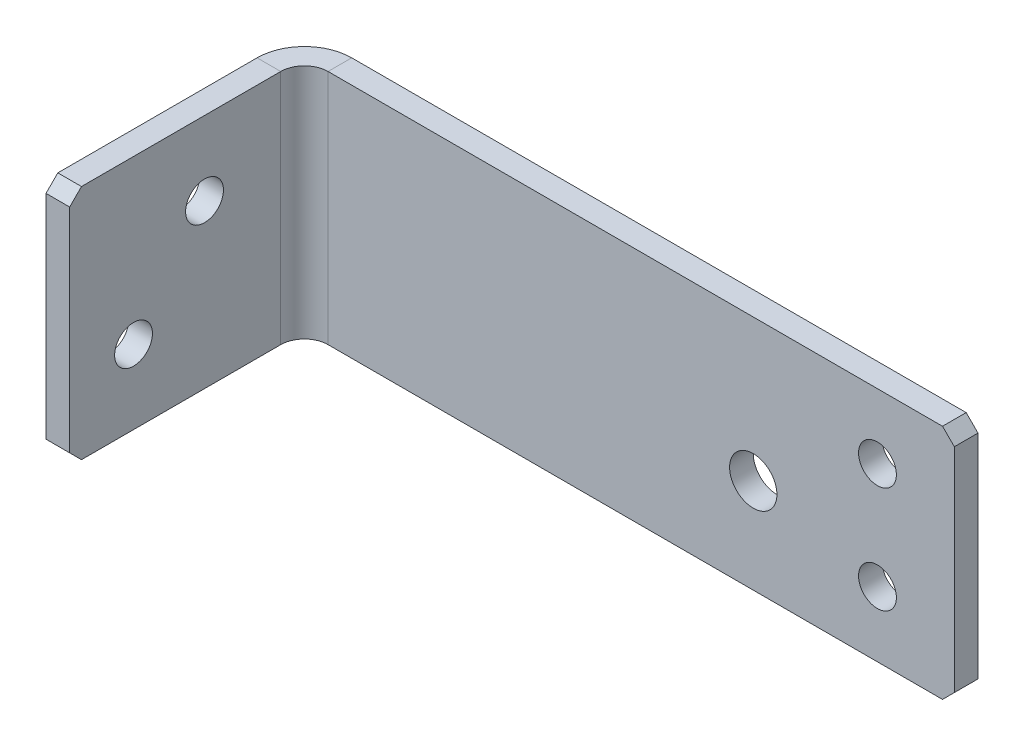
ISO-10303-21;
HEADER;
FILE_DESCRIPTION(('STEP AP214'),'2;1');
FILE_NAME('part.step','',(''),(''),'','','');
FILE_SCHEMA(('AUTOMOTIVE_DESIGN { 1 0 10303 214 1 1 1 1 }'));
ENDSEC;
DATA;
#1=APPLICATION_CONTEXT('core data for automotive mechanical design processes');
#2=APPLICATION_PROTOCOL_DEFINITION('international standard','automotive_design',2000,#1);
#3=PRODUCT_CONTEXT('',#1,'mechanical');
#4=PRODUCT('Part','Part','',(#3));
#5=PRODUCT_RELATED_PRODUCT_CATEGORY('part','',(#4));
#6=PRODUCT_DEFINITION_FORMATION('','',#4);
#7=PRODUCT_DEFINITION_CONTEXT('part definition',#1,'design');
#8=PRODUCT_DEFINITION('design','',#6,#7);
#9=PRODUCT_DEFINITION_SHAPE('','',#8);
#10=(LENGTH_UNIT() NAMED_UNIT(*) SI_UNIT(.MILLI.,.METRE.));
#11=(NAMED_UNIT(*) PLANE_ANGLE_UNIT() SI_UNIT($,.RADIAN.));
#12=(NAMED_UNIT(*) SI_UNIT($,.STERADIAN.) SOLID_ANGLE_UNIT());
#13=UNCERTAINTY_MEASURE_WITH_UNIT(LENGTH_MEASURE(1.E-05),#10,'distance_accuracy_value','');
#14=(GEOMETRIC_REPRESENTATION_CONTEXT(3) GLOBAL_UNCERTAINTY_ASSIGNED_CONTEXT((#13)) GLOBAL_UNIT_ASSIGNED_CONTEXT((#10,
#11,#12)) REPRESENTATION_CONTEXT('',''));
#15=CARTESIAN_POINT('',(0.,0.,0.));
#16=DIRECTION('',(0.,0.,1.));
#17=DIRECTION('',(1.,0.,0.));
#18=AXIS2_PLACEMENT_3D('',#15,#16,#17);
#19=CARTESIAN_POINT('',(18.5561944901924,0.,21.8438055098076));
#20=DIRECTION('',(1.,0.,0.));
#21=DIRECTION('',(0.,0.,-1.));
#22=AXIS2_PLACEMENT_3D('',#19,#20,#21);
#23=PLANE('',#22);
#24=CARTESIAN_POINT('',(18.5561944901924,6.25,16.4438055098076));
#25=DIRECTION('',(1.,0.,0.));
#26=DIRECTION('',(0.,0.,-1.));
#27=AXIS2_PLACEMENT_3D('',#24,#25,#26);
#28=CIRCLE('',#27,1.6);
#29=CARTESIAN_POINT('',(18.5561944901924,6.25,14.8438055098076));
#30=VERTEX_POINT('',#29);
#31=EDGE_CURVE('E220',#30,#30,#28,.T.);
#32=ORIENTED_EDGE('',*,*,#31,.T.);
#33=EDGE_LOOP('',(#32));
#34=FACE_BOUND('',#33,.T.);
#35=CARTESIAN_POINT('',(18.5561944901924,13.75,10.4438055098077));
#36=DIRECTION('',(1.,0.,0.));
#37=DIRECTION('',(0.,0.,-1.));
#38=AXIS2_PLACEMENT_3D('',#35,#36,#37);
#39=CIRCLE('',#38,1.6);
#40=CARTESIAN_POINT('',(18.5561944901924,13.75,8.84380550980767));
#41=VERTEX_POINT('',#40);
#42=EDGE_CURVE('E214',#41,#41,#39,.T.);
#43=ORIENTED_EDGE('',*,*,#42,.T.);
#44=EDGE_LOOP('',(#43));
#45=FACE_BOUND('',#44,.T.);
#46=DIRECTION('',(0.,0.,-1.));
#47=VECTOR('',#46,1.);
#48=CARTESIAN_POINT('',(18.5561944901924,0.,21.8438055098076));
#49=LINE('',#48,#47);
#50=CARTESIAN_POINT('',(18.5561944901924,0.,20.8438055098076));
#51=VERTEX_POINT('',#50);
#52=CARTESIAN_POINT('',(18.5561944901924,0.,4.));
#53=VERTEX_POINT('',#52);
#54=EDGE_CURVE('E229',#51,#53,#49,.T.);
#55=ORIENTED_EDGE('',*,*,#54,.F.);
#56=DIRECTION('',(0.,-0.707106781186548,-0.707106781186547));
#57=VECTOR('',#56,1.);
#58=CARTESIAN_POINT('',(18.5561944901924,0.,20.8438055098076));
#59=LINE('',#58,#57);
#60=CARTESIAN_POINT('',(18.5561944901925,1.00000000000001,21.8438055098076));
#61=VERTEX_POINT('',#60);
#62=EDGE_CURVE('E69',#51,#61,#59,.F.);
#63=ORIENTED_EDGE('',*,*,#62,.T.);
#64=DIRECTION('',(0.,-1.,0.));
#65=VECTOR('',#64,1.);
#66=CARTESIAN_POINT('',(18.5561944901924,20.,21.8438055098076));
#67=LINE('',#66,#65);
#68=CARTESIAN_POINT('',(18.5561944901924,19.,21.8438055098076));
#69=VERTEX_POINT('',#68);
#70=EDGE_CURVE('E223',#69,#61,#67,.T.);
#71=ORIENTED_EDGE('',*,*,#70,.F.);
#72=DIRECTION('',(0.,-0.707106781186547,0.707106781186547));
#73=VECTOR('',#72,1.);
#74=CARTESIAN_POINT('',(18.5561944901924,19.,21.8438055098076));
#75=LINE('',#74,#73);
#76=CARTESIAN_POINT('',(18.5561944901924,20.,20.8438055098076));
#77=VERTEX_POINT('',#76);
#78=EDGE_CURVE('E269',#69,#77,#75,.F.);
#79=ORIENTED_EDGE('',*,*,#78,.T.);
#80=DIRECTION('',(0.,0.,1.));
#81=VECTOR('',#80,1.);
#82=CARTESIAN_POINT('',(18.5561944901924,20.,21.8438055098076));
#83=LINE('',#82,#81);
#84=CARTESIAN_POINT('',(18.5561944901924,20.,4.));
#85=VERTEX_POINT('',#84);
#86=EDGE_CURVE('E227',#85,#77,#83,.T.);
#87=ORIENTED_EDGE('',*,*,#86,.F.);
#88=DIRECTION('',(0.,-1.,0.));
#89=VECTOR('',#88,1.);
#90=CARTESIAN_POINT('',(18.5561944901924,0.,4.));
#91=LINE('',#90,#89);
#92=EDGE_CURVE('E235',#85,#53,#91,.T.);
#93=ORIENTED_EDGE('',*,*,#92,.T.);
#94=EDGE_LOOP('',(#55,#63,#71,#79,#87,#93));
#95=FACE_BOUND('',#94,.T.);
#96=ADVANCED_FACE('F46',(#34,#45,#95),#23,.F.);
#97=CARTESIAN_POINT('',(20.5561944901924,20.,21.8438055098076));
#98=DIRECTION('',(0.,-1.,0.));
#99=DIRECTION('',(-1.,0.,0.));
#100=AXIS2_PLACEMENT_3D('',#97,#98,#99);
#101=PLANE('',#100);
#102=ORIENTED_EDGE('',*,*,#86,.T.);
#103=DIRECTION('',(1.,0.,0.));
#104=VECTOR('',#103,1.);
#105=CARTESIAN_POINT('',(20.5561944901924,20.,20.8438055098076));
#106=LINE('',#105,#104);
#107=CARTESIAN_POINT('',(20.5561944901924,20.,20.8438055098076));
#108=VERTEX_POINT('',#107);
#109=EDGE_CURVE('E271',#77,#108,#106,.T.);
#110=ORIENTED_EDGE('',*,*,#109,.T.);
#111=DIRECTION('',(0.,0.,1.));
#112=VECTOR('',#111,1.);
#113=CARTESIAN_POINT('',(20.5561944901924,20.,21.8438055098076));
#114=LINE('',#113,#112);
#115=CARTESIAN_POINT('',(20.5561944901924,20.,4.));
#116=VERTEX_POINT('',#115);
#117=EDGE_CURVE('E232',#116,#108,#114,.T.);
#118=ORIENTED_EDGE('',*,*,#117,.F.);
#119=DIRECTION('',(-1.,0.,0.));
#120=VECTOR('',#119,1.);
#121=CARTESIAN_POINT('',(20.5561944901924,20.,4.));
#122=LINE('',#121,#120);
#123=EDGE_CURVE('E238',#116,#85,#122,.T.);
#124=ORIENTED_EDGE('',*,*,#123,.T.);
#125=EDGE_LOOP('',(#102,#110,#118,#124));
#126=FACE_BOUND('',#125,.T.);
#127=ADVANCED_FACE('F321',(#126),#101,.F.);
#128=CARTESIAN_POINT('',(20.5561944901924,0.,21.8438055098076));
#129=DIRECTION('',(0.,1.,0.));
#130=DIRECTION('',(1.,0.,0.));
#131=AXIS2_PLACEMENT_3D('',#128,#129,#130);
#132=PLANE('',#131);
#133=DIRECTION('',(0.,0.,-1.));
#134=VECTOR('',#133,1.);
#135=CARTESIAN_POINT('',(20.5561944901924,0.,21.8438055098076));
#136=LINE('',#135,#134);
#137=CARTESIAN_POINT('',(20.5561944901924,0.,20.8438055098076));
#138=VERTEX_POINT('',#137);
#139=CARTESIAN_POINT('',(20.5561944901924,0.,4.));
#140=VERTEX_POINT('',#139);
#141=EDGE_CURVE('E226',#138,#140,#136,.T.);
#142=ORIENTED_EDGE('',*,*,#141,.F.);
#143=DIRECTION('',(-1.,0.,0.));
#144=VECTOR('',#143,1.);
#145=CARTESIAN_POINT('',(20.5561944901924,0.,20.8438055098076));
#146=LINE('',#145,#144);
#147=EDGE_CURVE('E275',#138,#51,#146,.T.);
#148=ORIENTED_EDGE('',*,*,#147,.T.);
#149=ORIENTED_EDGE('',*,*,#54,.T.);
#150=DIRECTION('',(1.,0.,0.));
#151=VECTOR('',#150,1.);
#152=CARTESIAN_POINT('',(20.5561944901924,0.,4.));
#153=LINE('',#152,#151);
#154=EDGE_CURVE('E231',#53,#140,#153,.T.);
#155=ORIENTED_EDGE('',*,*,#154,.T.);
#156=EDGE_LOOP('',(#142,#148,#149,#155));
#157=FACE_BOUND('',#156,.T.);
#158=ADVANCED_FACE('F281',(#157),#132,.F.);
#159=CARTESIAN_POINT('',(20.5561944901924,20.,21.8438055098076));
#160=DIRECTION('',(0.,0.,-1.));
#161=DIRECTION('',(0.,1.,0.));
#162=AXIS2_PLACEMENT_3D('',#159,#160,#161);
#163=PLANE('',#162);
#164=ORIENTED_EDGE('',*,*,#70,.T.);
#165=DIRECTION('',(1.,0.,0.));
#166=VECTOR('',#165,1.);
#167=CARTESIAN_POINT('',(20.5561944901925,1.00000000000001,21.8438055098076));
#168=LINE('',#167,#166);
#169=CARTESIAN_POINT('',(20.5561944901925,1.00000000000001,21.8438055098076));
#170=VERTEX_POINT('',#169);
#171=EDGE_CURVE('E55',#61,#170,#168,.T.);
#172=ORIENTED_EDGE('',*,*,#171,.T.);
#173=DIRECTION('',(0.,-1.,0.));
#174=VECTOR('',#173,1.);
#175=CARTESIAN_POINT('',(20.5561944901924,20.,21.8438055098076));
#176=LINE('',#175,#174);
#177=CARTESIAN_POINT('',(20.5561944901924,19.,21.8438055098076));
#178=VERTEX_POINT('',#177);
#179=EDGE_CURVE('E224',#178,#170,#176,.T.);
#180=ORIENTED_EDGE('',*,*,#179,.F.);
#181=DIRECTION('',(-1.,0.,0.));
#182=VECTOR('',#181,1.);
#183=CARTESIAN_POINT('',(20.5561944901924,19.,21.8438055098076));
#184=LINE('',#183,#182);
#185=EDGE_CURVE('E266',#178,#69,#184,.T.);
#186=ORIENTED_EDGE('',*,*,#185,.T.);
#187=EDGE_LOOP('',(#164,#172,#180,#186));
#188=FACE_BOUND('',#187,.T.);
#189=ADVANCED_FACE('F343',(#188),#163,.F.);
#190=CARTESIAN_POINT('',(20.5561944901924,0.,21.8438055098076));
#191=DIRECTION('',(1.,0.,0.));
#192=DIRECTION('',(0.,0.,-1.));
#193=AXIS2_PLACEMENT_3D('',#190,#191,#192);
#194=PLANE('',#193);
#195=ORIENTED_EDGE('',*,*,#179,.T.);
#196=DIRECTION('',(0.,0.707106781186548,0.707106781186547));
#197=VECTOR('',#196,1.);
#198=CARTESIAN_POINT('',(20.5561944901925,0.500000000000007,21.3438055098076));
#199=LINE('',#198,#197);
#200=EDGE_CURVE('E12',#170,#138,#199,.F.);
#201=ORIENTED_EDGE('',*,*,#200,.T.);
#202=ORIENTED_EDGE('',*,*,#141,.T.);
#203=DIRECTION('',(0.,-1.,0.));
#204=VECTOR('',#203,1.);
#205=CARTESIAN_POINT('',(20.5561944901924,0.,4.));
#206=LINE('',#205,#204);
#207=EDGE_CURVE('E173',#116,#140,#206,.T.);
#208=ORIENTED_EDGE('',*,*,#207,.F.);
#209=ORIENTED_EDGE('',*,*,#117,.T.);
#210=DIRECTION('',(0.,0.707106781186547,-0.707106781186547));
#211=VECTOR('',#210,1.);
#212=CARTESIAN_POINT('',(20.5561944901925,9.5,31.3438055098076));
#213=LINE('',#212,#211);
#214=EDGE_CURVE('E273',#108,#178,#213,.F.);
#215=ORIENTED_EDGE('',*,*,#214,.T.);
#216=EDGE_LOOP('',(#195,#201,#202,#208,#209,#215));
#217=FACE_BOUND('',#216,.T.);
#218=CARTESIAN_POINT('',(20.5561944901924,13.75,10.4438055098077));
#219=DIRECTION('',(1.,0.,0.));
#220=DIRECTION('',(0.,0.,-1.));
#221=AXIS2_PLACEMENT_3D('',#218,#219,#220);
#222=CIRCLE('',#221,1.59999999999999);
#223=CARTESIAN_POINT('',(20.5561944901924,13.75,8.84380550980768));
#224=VERTEX_POINT('',#223);
#225=EDGE_CURVE('E187',#224,#224,#222,.T.);
#226=ORIENTED_EDGE('',*,*,#225,.F.);
#227=EDGE_LOOP('',(#226));
#228=FACE_BOUND('',#227,.T.);
#229=CARTESIAN_POINT('',(20.5561944901924,6.25000000000001,16.4438055098076));
#230=DIRECTION('',(1.,0.,0.));
#231=DIRECTION('',(0.,0.,-1.));
#232=AXIS2_PLACEMENT_3D('',#229,#230,#231);
#233=CIRCLE('',#232,1.59999999999999);
#234=CARTESIAN_POINT('',(20.5561944901924,6.25000000000001,14.8438055098076));
#235=VERTEX_POINT('',#234);
#236=EDGE_CURVE('E217',#235,#235,#233,.T.);
#237=ORIENTED_EDGE('',*,*,#236,.F.);
#238=EDGE_LOOP('',(#237));
#239=FACE_BOUND('',#238,.T.);
#240=ADVANCED_FACE('F344',(#217,#228,#239),#194,.T.);
#241=CARTESIAN_POINT('',(20.5561944901924,6.25000000000001,16.4438055098076));
#242=DIRECTION('',(1.,0.,0.));
#243=DIRECTION('',(0.,0.,-1.));
#244=AXIS2_PLACEMENT_3D('',#241,#242,#243);
#245=CYLINDRICAL_SURFACE('',#244,1.59999999999999);
#246=ORIENTED_EDGE('',*,*,#31,.F.);
#247=EDGE_LOOP('',(#246));
#248=FACE_BOUND('',#247,.T.);
#249=ORIENTED_EDGE('',*,*,#236,.T.);
#250=EDGE_LOOP('',(#249));
#251=FACE_BOUND('',#250,.T.);
#252=ADVANCED_FACE('F347',(#248,#251),#245,.F.);
#253=CARTESIAN_POINT('',(20.5561944901924,13.75,10.4438055098077));
#254=DIRECTION('',(1.,0.,0.));
#255=DIRECTION('',(0.,0.,-1.));
#256=AXIS2_PLACEMENT_3D('',#253,#254,#255);
#257=CYLINDRICAL_SURFACE('',#256,1.59999999999999);
#258=ORIENTED_EDGE('',*,*,#42,.F.);
#259=EDGE_LOOP('',(#258));
#260=FACE_BOUND('',#259,.T.);
#261=ORIENTED_EDGE('',*,*,#225,.T.);
#262=EDGE_LOOP('',(#261));
#263=FACE_BOUND('',#262,.T.);
#264=ADVANCED_FACE('F353',(#260,#263),#257,.F.);
#265=CARTESIAN_POINT('',(75.5,20.,2.));
#266=DIRECTION('',(-1.,0.,0.));
#267=DIRECTION('',(0.,0.,1.));
#268=AXIS2_PLACEMENT_3D('',#265,#266,#267);
#269=PLANE('',#268);
#270=DIRECTION('',(0.,1.,0.));
#271=VECTOR('',#270,1.);
#272=CARTESIAN_POINT('',(75.5,20.,2.));
#273=LINE('',#272,#271);
#274=CARTESIAN_POINT('',(75.5000000000001,1.00000000000001,2.));
#275=VERTEX_POINT('',#274);
#276=CARTESIAN_POINT('',(75.5,19.,2.));
#277=VERTEX_POINT('',#276);
#278=EDGE_CURVE('E147',#275,#277,#273,.T.);
#279=ORIENTED_EDGE('',*,*,#278,.F.);
#280=DIRECTION('',(0.,0.,-1.));
#281=VECTOR('',#280,1.);
#282=CARTESIAN_POINT('',(75.5000000000001,1.00000000000001,2.));
#283=LINE('',#282,#281);
#284=CARTESIAN_POINT('',(75.5000000000001,1.00000000000001,0.));
#285=VERTEX_POINT('',#284);
#286=EDGE_CURVE('E258',#275,#285,#283,.T.);
#287=ORIENTED_EDGE('',*,*,#286,.T.);
#288=DIRECTION('',(0.,1.,0.));
#289=VECTOR('',#288,1.);
#290=CARTESIAN_POINT('',(75.5,20.,0.));
#291=LINE('',#290,#289);
#292=CARTESIAN_POINT('',(75.5,19.,0.));
#293=VERTEX_POINT('',#292);
#294=EDGE_CURVE('E168',#285,#293,#291,.T.);
#295=ORIENTED_EDGE('',*,*,#294,.T.);
#296=DIRECTION('',(0.,0.,1.));
#297=VECTOR('',#296,1.);
#298=CARTESIAN_POINT('',(75.5,19.,2.));
#299=LINE('',#298,#297);
#300=EDGE_CURVE('E253',#293,#277,#299,.T.);
#301=ORIENTED_EDGE('',*,*,#300,.T.);
#302=EDGE_LOOP('',(#279,#287,#295,#301));
#303=FACE_BOUND('',#302,.T.);
#304=ADVANCED_FACE('F306',(#303),#269,.F.);
#305=CARTESIAN_POINT('',(58.5,8.00000000000001,2.));
#306=DIRECTION('',(0.,0.,1.));
#307=DIRECTION('',(1.,0.,0.));
#308=AXIS2_PLACEMENT_3D('',#305,#306,#307);
#309=CYLINDRICAL_SURFACE('',#308,2.);
#310=CARTESIAN_POINT('',(58.5,8.00000000000001,0.));
#311=DIRECTION('',(0.,0.,1.));
#312=DIRECTION('',(1.,0.,0.));
#313=AXIS2_PLACEMENT_3D('',#310,#311,#312);
#314=CIRCLE('',#313,1.99999999999999);
#315=CARTESIAN_POINT('',(60.5,8.00000000000001,0.));
#316=VERTEX_POINT('',#315);
#317=EDGE_CURVE('E194',#316,#316,#314,.T.);
#318=CARTESIAN_POINT('',(58.5,8.00000000000001,2.));
#319=DIRECTION('',(0.,0.,1.));
#320=DIRECTION('',(1.,0.,0.));
#321=AXIS2_PLACEMENT_3D('',#318,#319,#320);
#322=CIRCLE('',#321,2.);
#323=CARTESIAN_POINT('',(60.5,8.00000000000001,2.));
#324=VERTEX_POINT('',#323);
#325=EDGE_CURVE('E207',#324,#324,#322,.T.);
#326=CARTESIAN_POINT('',(60.5,8.00000000000001,0.));
#327=CARTESIAN_POINT('',(60.5,8.00000000000001,0.0208333333333333));
#328=CARTESIAN_POINT('',(60.5,8.00000000000001,0.0416666666666667));
#329=CARTESIAN_POINT('',(60.5,8.00000000000001,0.0833333333333334));
#330=CARTESIAN_POINT('',(60.5,8.00000000000001,0.104166666666667));
#331=CARTESIAN_POINT('',(60.5,8.00000000000001,0.145833333333333));
#332=CARTESIAN_POINT('',(60.5,8.00000000000001,0.166666666666667));
#333=CARTESIAN_POINT('',(60.5,8.00000000000001,0.208333333333334));
#334=CARTESIAN_POINT('',(60.5,8.00000000000001,0.229166666666667));
#335=CARTESIAN_POINT('',(60.5,8.00000000000001,0.270833333333333));
#336=CARTESIAN_POINT('',(60.5,8.00000000000001,0.291666666666667));
#337=CARTESIAN_POINT('',(60.5,8.00000000000001,0.333333333333333));
#338=CARTESIAN_POINT('',(60.5,8.00000000000001,0.354166666666667));
#339=CARTESIAN_POINT('',(60.5,8.00000000000001,0.395833333333334));
#340=CARTESIAN_POINT('',(60.5,8.00000000000001,0.416666666666667));
#341=CARTESIAN_POINT('',(60.5,8.00000000000001,0.458333333333334));
#342=CARTESIAN_POINT('',(60.5,8.00000000000001,0.479166666666667));
#343=CARTESIAN_POINT('',(60.5,8.00000000000001,0.520833333333334));
#344=CARTESIAN_POINT('',(60.5,8.00000000000001,0.541666666666667));
#345=CARTESIAN_POINT('',(60.5,8.00000000000001,0.583333333333334));
#346=CARTESIAN_POINT('',(60.5,8.00000000000001,0.604166666666667));
#347=CARTESIAN_POINT('',(60.5,8.00000000000001,0.645833333333334));
#348=CARTESIAN_POINT('',(60.5,8.00000000000001,0.666666666666667));
#349=CARTESIAN_POINT('',(60.5,8.00000000000001,0.708333333333334));
#350=CARTESIAN_POINT('',(60.5,8.00000000000001,0.729166666666668));
#351=CARTESIAN_POINT('',(60.5,8.00000000000001,0.770833333333334));
#352=CARTESIAN_POINT('',(60.5,8.00000000000001,0.791666666666667));
#353=CARTESIAN_POINT('',(60.5,8.00000000000001,0.833333333333334));
#354=CARTESIAN_POINT('',(60.5,8.00000000000001,0.854166666666667));
#355=CARTESIAN_POINT('',(60.5,8.00000000000001,0.895833333333334));
#356=CARTESIAN_POINT('',(60.5,8.00000000000001,0.916666666666668));
#357=CARTESIAN_POINT('',(60.5,8.00000000000001,0.958333333333334));
#358=CARTESIAN_POINT('',(60.5,8.00000000000001,0.979166666666668));
#359=CARTESIAN_POINT('',(60.5,8.00000000000001,1.02083333333333));
#360=CARTESIAN_POINT('',(60.5,8.00000000000001,1.04166666666667));
#361=CARTESIAN_POINT('',(60.5,8.00000000000001,1.08333333333333));
#362=CARTESIAN_POINT('',(60.5,8.00000000000001,1.10416666666667));
#363=CARTESIAN_POINT('',(60.5,8.00000000000001,1.14583333333333));
#364=CARTESIAN_POINT('',(60.5,8.00000000000001,1.16666666666667));
#365=CARTESIAN_POINT('',(60.5,8.00000000000001,1.20833333333333));
#366=CARTESIAN_POINT('',(60.5,8.00000000000001,1.22916666666667));
#367=CARTESIAN_POINT('',(60.5,8.00000000000001,1.27083333333333));
#368=CARTESIAN_POINT('',(60.5,8.00000000000001,1.29166666666667));
#369=CARTESIAN_POINT('',(60.5,8.00000000000001,1.33333333333333));
#370=CARTESIAN_POINT('',(60.5,8.00000000000001,1.35416666666667));
#371=CARTESIAN_POINT('',(60.5,8.00000000000001,1.39583333333333));
#372=CARTESIAN_POINT('',(60.5,8.00000000000001,1.41666666666667));
#373=CARTESIAN_POINT('',(60.5,8.00000000000001,1.45833333333333));
#374=CARTESIAN_POINT('',(60.5,8.00000000000001,1.47916666666667));
#375=CARTESIAN_POINT('',(60.5,8.00000000000001,1.52083333333333));
#376=CARTESIAN_POINT('',(60.5,8.00000000000001,1.54166666666667));
#377=CARTESIAN_POINT('',(60.5,8.00000000000001,1.58333333333333));
#378=CARTESIAN_POINT('',(60.5,8.00000000000001,1.60416666666667));
#379=CARTESIAN_POINT('',(60.5,8.00000000000001,1.64583333333333));
#380=CARTESIAN_POINT('',(60.5,8.00000000000001,1.66666666666667));
#381=CARTESIAN_POINT('',(60.5,8.00000000000001,1.70833333333333));
#382=CARTESIAN_POINT('',(60.5,8.00000000000001,1.72916666666667));
#383=CARTESIAN_POINT('',(60.5,8.00000000000001,1.77083333333334));
#384=CARTESIAN_POINT('',(60.5,8.00000000000001,1.79166666666667));
#385=CARTESIAN_POINT('',(60.5,8.00000000000001,1.83333333333334));
#386=CARTESIAN_POINT('',(60.5,8.00000000000001,1.85416666666667));
#387=CARTESIAN_POINT('',(60.5,8.00000000000001,1.89583333333334));
#388=CARTESIAN_POINT('',(60.5,8.00000000000001,1.91666666666667));
#389=CARTESIAN_POINT('',(60.5,8.00000000000001,1.95833333333334));
#390=CARTESIAN_POINT('',(60.5,8.00000000000001,1.97916666666667));
#391=CARTESIAN_POINT('',(60.5,8.00000000000001,2.));
#392=B_SPLINE_CURVE_WITH_KNOTS('',3,(#326,#327,#328,#329,#330,#331,#332,#333,#334,#335,#336,
#337,#338,#339,#340,#341,#342,#343,#344,#345,#346,#347,#348,#349,#350,#351,#352,#353,#354,#355,
#356,#357,#358,#359,#360,#361,#362,#363,#364,#365,#366,#367,#368,#369,#370,#371,#372,#373,#374,
#375,#376,#377,#378,#379,#380,#381,#382,#383,#384,#385,#386,#387,#388,#389,#390,#391),
.UNSPECIFIED.,.F.,.F.,(4,2,2,2,2,2,2,2,2,2,2,2,2,2,2,2,2,2,2,2,2,2,2,2,2,2,2,2,2,2,2,2,4),(0.,
0.0625000000000001,0.125,0.1875,0.25,0.3125,0.375,0.4375,0.5,0.5625,0.625000000000001,
0.687500000000001,0.750000000000001,0.812500000000001,0.875000000000001,0.937500000000001,1.,
1.0625,1.125,1.1875,1.25,1.3125,1.375,1.4375,1.5,1.5625,1.625,1.6875,1.75,1.8125,1.875,1.9375,
2.),.UNSPECIFIED.);
#393=EDGE_CURVE('BSEAM374',#316,#324,#392,.T.);
#394=ORIENTED_EDGE('',*,*,#317,.F.);
#395=ORIENTED_EDGE('',*,*,#325,.T.);
#396=ORIENTED_EDGE('',*,*,#393,.T.);
#397=ORIENTED_EDGE('',*,*,#393,.F.);
#398=EDGE_LOOP('',(#394,#396,#395,#397));
#399=FACE_BOUND('',#398,.T.);
#400=ADVANCED_FACE('F374',(#399),#309,.F.);
#401=CARTESIAN_POINT('',(69.,14.5,2.));
#402=DIRECTION('',(0.,0.,1.));
#403=DIRECTION('',(1.,0.,0.));
#404=AXIS2_PLACEMENT_3D('',#401,#402,#403);
#405=CYLINDRICAL_SURFACE('',#404,1.59999999999999);
#406=CARTESIAN_POINT('',(69.,14.5,0.));
#407=DIRECTION('',(0.,0.,1.));
#408=DIRECTION('',(1.,0.,0.));
#409=AXIS2_PLACEMENT_3D('',#406,#407,#408);
#410=CIRCLE('',#409,1.59999999999999);
#411=CARTESIAN_POINT('',(70.6,14.5,0.));
#412=VERTEX_POINT('',#411);
#413=EDGE_CURVE('E191',#412,#412,#410,.T.);
#414=CARTESIAN_POINT('',(69.,14.5,2.));
#415=DIRECTION('',(0.,0.,1.));
#416=DIRECTION('',(1.,0.,0.));
#417=AXIS2_PLACEMENT_3D('',#414,#415,#416);
#418=CIRCLE('',#417,1.59999999999999);
#419=CARTESIAN_POINT('',(70.6,14.5,2.));
#420=VERTEX_POINT('',#419);
#421=EDGE_CURVE('E204',#420,#420,#418,.T.);
#422=CARTESIAN_POINT('',(70.6,14.5,0.));
#423=CARTESIAN_POINT('',(70.6,14.5,0.0208333333333333));
#424=CARTESIAN_POINT('',(70.6,14.5,0.0416666666666667));
#425=CARTESIAN_POINT('',(70.6,14.5,0.0833333333333334));
#426=CARTESIAN_POINT('',(70.6,14.5,0.104166666666667));
#427=CARTESIAN_POINT('',(70.6,14.5,0.145833333333333));
#428=CARTESIAN_POINT('',(70.6,14.5,0.166666666666667));
#429=CARTESIAN_POINT('',(70.6,14.5,0.208333333333334));
#430=CARTESIAN_POINT('',(70.6,14.5,0.229166666666667));
#431=CARTESIAN_POINT('',(70.6,14.5,0.270833333333334));
#432=CARTESIAN_POINT('',(70.6,14.5,0.291666666666667));
#433=CARTESIAN_POINT('',(70.6,14.5,0.333333333333334));
#434=CARTESIAN_POINT('',(70.6,14.5,0.354166666666667));
#435=CARTESIAN_POINT('',(70.6,14.5,0.395833333333334));
#436=CARTESIAN_POINT('',(70.6,14.5,0.416666666666667));
#437=CARTESIAN_POINT('',(70.6,14.5,0.458333333333334));
#438=CARTESIAN_POINT('',(70.6,14.5,0.479166666666667));
#439=CARTESIAN_POINT('',(70.6,14.5,0.520833333333334));
#440=CARTESIAN_POINT('',(70.6,14.5,0.541666666666667));
#441=CARTESIAN_POINT('',(70.6,14.5,0.583333333333334));
#442=CARTESIAN_POINT('',(70.6,14.5,0.604166666666667));
#443=CARTESIAN_POINT('',(70.6,14.5,0.645833333333334));
#444=CARTESIAN_POINT('',(70.6,14.5,0.666666666666668));
#445=CARTESIAN_POINT('',(70.6,14.5,0.708333333333334));
#446=CARTESIAN_POINT('',(70.6,14.5,0.729166666666668));
#447=CARTESIAN_POINT('',(70.6,14.5,0.770833333333334));
#448=CARTESIAN_POINT('',(70.6,14.5,0.791666666666667));
#449=CARTESIAN_POINT('',(70.6,14.5,0.833333333333334));
#450=CARTESIAN_POINT('',(70.6,14.5,0.854166666666667));
#451=CARTESIAN_POINT('',(70.6,14.5,0.895833333333334));
#452=CARTESIAN_POINT('',(70.6,14.5,0.916666666666668));
#453=CARTESIAN_POINT('',(70.6,14.5,0.958333333333334));
#454=CARTESIAN_POINT('',(70.6,14.5,0.979166666666668));
#455=CARTESIAN_POINT('',(70.6,14.5,1.02083333333333));
#456=CARTESIAN_POINT('',(70.6,14.5,1.04166666666667));
#457=CARTESIAN_POINT('',(70.6,14.5,1.08333333333333));
#458=CARTESIAN_POINT('',(70.6,14.5,1.10416666666667));
#459=CARTESIAN_POINT('',(70.6,14.5,1.14583333333333));
#460=CARTESIAN_POINT('',(70.6,14.5,1.16666666666667));
#461=CARTESIAN_POINT('',(70.6,14.5,1.20833333333333));
#462=CARTESIAN_POINT('',(70.6,14.5,1.22916666666667));
#463=CARTESIAN_POINT('',(70.6,14.5,1.27083333333334));
#464=CARTESIAN_POINT('',(70.6,14.5,1.29166666666667));
#465=CARTESIAN_POINT('',(70.6,14.5,1.33333333333334));
#466=CARTESIAN_POINT('',(70.6,14.5,1.35416666666667));
#467=CARTESIAN_POINT('',(70.6,14.5,1.39583333333333));
#468=CARTESIAN_POINT('',(70.6,14.5,1.41666666666667));
#469=CARTESIAN_POINT('',(70.6,14.5,1.45833333333333));
#470=CARTESIAN_POINT('',(70.6,14.5,1.47916666666667));
#471=CARTESIAN_POINT('',(70.6,14.5,1.52083333333334));
#472=CARTESIAN_POINT('',(70.6,14.5,1.54166666666667));
#473=CARTESIAN_POINT('',(70.6,14.5,1.58333333333334));
#474=CARTESIAN_POINT('',(70.6,14.5,1.60416666666667));
#475=CARTESIAN_POINT('',(70.6,14.5,1.64583333333334));
#476=CARTESIAN_POINT('',(70.6,14.5,1.66666666666667));
#477=CARTESIAN_POINT('',(70.6,14.5,1.70833333333334));
#478=CARTESIAN_POINT('',(70.6,14.5,1.72916666666667));
#479=CARTESIAN_POINT('',(70.6,14.5,1.77083333333334));
#480=CARTESIAN_POINT('',(70.6,14.5,1.79166666666667));
#481=CARTESIAN_POINT('',(70.6,14.5,1.83333333333334));
#482=CARTESIAN_POINT('',(70.6,14.5,1.85416666666667));
#483=CARTESIAN_POINT('',(70.6,14.5,1.89583333333334));
#484=CARTESIAN_POINT('',(70.6,14.5,1.91666666666667));
#485=CARTESIAN_POINT('',(70.6,14.5,1.95833333333334));
#486=CARTESIAN_POINT('',(70.6,14.5,1.97916666666667));
#487=CARTESIAN_POINT('',(70.6,14.5,2.));
#488=B_SPLINE_CURVE_WITH_KNOTS('',3,(#422,#423,#424,#425,#426,#427,#428,#429,#430,#431,#432,
#433,#434,#435,#436,#437,#438,#439,#440,#441,#442,#443,#444,#445,#446,#447,#448,#449,#450,#451,
#452,#453,#454,#455,#456,#457,#458,#459,#460,#461,#462,#463,#464,#465,#466,#467,#468,#469,#470,
#471,#472,#473,#474,#475,#476,#477,#478,#479,#480,#481,#482,#483,#484,#485,#486,#487),
.UNSPECIFIED.,.F.,.F.,(4,2,2,2,2,2,2,2,2,2,2,2,2,2,2,2,2,2,2,2,2,2,2,2,2,2,2,2,2,2,2,2,4),(0.,
0.0625000000000001,0.125,0.1875,0.25,0.3125,0.375,0.4375,0.500000000000001,0.562500000000001,
0.625000000000001,0.687500000000001,0.750000000000001,0.812500000000001,0.875000000000001,
0.937500000000001,1.,1.0625,1.125,1.1875,1.25,1.3125,1.375,1.4375,1.5,1.5625,1.625,1.6875,1.75,
1.8125,1.875,1.9375,2.),.UNSPECIFIED.);
#489=EDGE_CURVE('BSEAM370',#412,#420,#488,.T.);
#490=ORIENTED_EDGE('',*,*,#413,.F.);
#491=ORIENTED_EDGE('',*,*,#421,.T.);
#492=ORIENTED_EDGE('',*,*,#489,.T.);
#493=ORIENTED_EDGE('',*,*,#489,.F.);
#494=EDGE_LOOP('',(#490,#492,#491,#493));
#495=FACE_BOUND('',#494,.T.);
#496=ADVANCED_FACE('F370',(#495),#405,.F.);
#497=CARTESIAN_POINT('',(69.,5.5,2.));
#498=DIRECTION('',(0.,0.,1.));
#499=DIRECTION('',(1.,0.,0.));
#500=AXIS2_PLACEMENT_3D('',#497,#498,#499);
#501=CYLINDRICAL_SURFACE('',#500,1.59999999999999);
#502=CARTESIAN_POINT('',(69.,5.5,0.));
#503=DIRECTION('',(0.,0.,1.));
#504=DIRECTION('',(1.,0.,0.));
#505=AXIS2_PLACEMENT_3D('',#502,#503,#504);
#506=CIRCLE('',#505,1.59999999999999);
#507=CARTESIAN_POINT('',(70.6,5.5,0.));
#508=VERTEX_POINT('',#507);
#509=EDGE_CURVE('E188',#508,#508,#506,.T.);
#510=CARTESIAN_POINT('',(69.,5.5,2.));
#511=DIRECTION('',(0.,0.,1.));
#512=DIRECTION('',(1.,0.,0.));
#513=AXIS2_PLACEMENT_3D('',#510,#511,#512);
#514=CIRCLE('',#513,1.59999999999999);
#515=CARTESIAN_POINT('',(70.6,5.5,2.));
#516=VERTEX_POINT('',#515);
#517=EDGE_CURVE('E201',#516,#516,#514,.T.);
#518=CARTESIAN_POINT('',(70.6,5.5,0.));
#519=CARTESIAN_POINT('',(70.6,5.5,0.0208333333333333));
#520=CARTESIAN_POINT('',(70.6,5.5,0.0416666666666667));
#521=CARTESIAN_POINT('',(70.6,5.5,0.0833333333333334));
#522=CARTESIAN_POINT('',(70.6,5.5,0.104166666666667));
#523=CARTESIAN_POINT('',(70.6,5.5,0.145833333333333));
#524=CARTESIAN_POINT('',(70.6,5.5,0.166666666666667));
#525=CARTESIAN_POINT('',(70.6,5.5,0.208333333333334));
#526=CARTESIAN_POINT('',(70.6,5.5,0.229166666666667));
#527=CARTESIAN_POINT('',(70.6,5.5,0.270833333333334));
#528=CARTESIAN_POINT('',(70.6,5.5,0.291666666666667));
#529=CARTESIAN_POINT('',(70.6,5.5,0.333333333333334));
#530=CARTESIAN_POINT('',(70.6,5.5,0.354166666666667));
#531=CARTESIAN_POINT('',(70.6,5.5,0.395833333333334));
#532=CARTESIAN_POINT('',(70.6,5.5,0.416666666666667));
#533=CARTESIAN_POINT('',(70.6,5.5,0.458333333333334));
#534=CARTESIAN_POINT('',(70.6,5.5,0.479166666666667));
#535=CARTESIAN_POINT('',(70.6,5.5,0.520833333333334));
#536=CARTESIAN_POINT('',(70.6,5.5,0.541666666666667));
#537=CARTESIAN_POINT('',(70.6,5.5,0.583333333333334));
#538=CARTESIAN_POINT('',(70.6,5.5,0.604166666666667));
#539=CARTESIAN_POINT('',(70.6,5.5,0.645833333333334));
#540=CARTESIAN_POINT('',(70.6,5.5,0.666666666666668));
#541=CARTESIAN_POINT('',(70.6,5.5,0.708333333333334));
#542=CARTESIAN_POINT('',(70.6,5.5,0.729166666666668));
#543=CARTESIAN_POINT('',(70.6,5.5,0.770833333333334));
#544=CARTESIAN_POINT('',(70.6,5.5,0.791666666666667));
#545=CARTESIAN_POINT('',(70.6,5.5,0.833333333333334));
#546=CARTESIAN_POINT('',(70.6,5.5,0.854166666666667));
#547=CARTESIAN_POINT('',(70.6,5.5,0.895833333333334));
#548=CARTESIAN_POINT('',(70.6,5.5,0.916666666666668));
#549=CARTESIAN_POINT('',(70.6,5.5,0.958333333333334));
#550=CARTESIAN_POINT('',(70.6,5.5,0.979166666666668));
#551=CARTESIAN_POINT('',(70.6,5.5,1.02083333333333));
#552=CARTESIAN_POINT('',(70.6,5.5,1.04166666666667));
#553=CARTESIAN_POINT('',(70.6,5.5,1.08333333333333));
#554=CARTESIAN_POINT('',(70.6,5.5,1.10416666666667));
#555=CARTESIAN_POINT('',(70.6,5.5,1.14583333333333));
#556=CARTESIAN_POINT('',(70.6,5.5,1.16666666666667));
#557=CARTESIAN_POINT('',(70.6,5.5,1.20833333333333));
#558=CARTESIAN_POINT('',(70.6,5.5,1.22916666666667));
#559=CARTESIAN_POINT('',(70.6,5.5,1.27083333333334));
#560=CARTESIAN_POINT('',(70.6,5.5,1.29166666666667));
#561=CARTESIAN_POINT('',(70.6,5.5,1.33333333333334));
#562=CARTESIAN_POINT('',(70.6,5.5,1.35416666666667));
#563=CARTESIAN_POINT('',(70.6,5.5,1.39583333333333));
#564=CARTESIAN_POINT('',(70.6,5.5,1.41666666666667));
#565=CARTESIAN_POINT('',(70.6,5.5,1.45833333333333));
#566=CARTESIAN_POINT('',(70.6,5.5,1.47916666666667));
#567=CARTESIAN_POINT('',(70.6,5.5,1.52083333333334));
#568=CARTESIAN_POINT('',(70.6,5.5,1.54166666666667));
#569=CARTESIAN_POINT('',(70.6,5.5,1.58333333333334));
#570=CARTESIAN_POINT('',(70.6,5.5,1.60416666666667));
#571=CARTESIAN_POINT('',(70.6,5.5,1.64583333333334));
#572=CARTESIAN_POINT('',(70.6,5.5,1.66666666666667));
#573=CARTESIAN_POINT('',(70.6,5.5,1.70833333333334));
#574=CARTESIAN_POINT('',(70.6,5.5,1.72916666666667));
#575=CARTESIAN_POINT('',(70.6,5.5,1.77083333333334));
#576=CARTESIAN_POINT('',(70.6,5.5,1.79166666666667));
#577=CARTESIAN_POINT('',(70.6,5.5,1.83333333333334));
#578=CARTESIAN_POINT('',(70.6,5.5,1.85416666666667));
#579=CARTESIAN_POINT('',(70.6,5.5,1.89583333333334));
#580=CARTESIAN_POINT('',(70.6,5.5,1.91666666666667));
#581=CARTESIAN_POINT('',(70.6,5.5,1.95833333333334));
#582=CARTESIAN_POINT('',(70.6,5.5,1.97916666666667));
#583=CARTESIAN_POINT('',(70.6,5.5,2.));
#584=B_SPLINE_CURVE_WITH_KNOTS('',3,(#518,#519,#520,#521,#522,#523,#524,#525,#526,#527,#528,
#529,#530,#531,#532,#533,#534,#535,#536,#537,#538,#539,#540,#541,#542,#543,#544,#545,#546,#547,
#548,#549,#550,#551,#552,#553,#554,#555,#556,#557,#558,#559,#560,#561,#562,#563,#564,#565,#566,
#567,#568,#569,#570,#571,#572,#573,#574,#575,#576,#577,#578,#579,#580,#581,#582,#583),
.UNSPECIFIED.,.F.,.F.,(4,2,2,2,2,2,2,2,2,2,2,2,2,2,2,2,2,2,2,2,2,2,2,2,2,2,2,2,2,2,2,2,4),(0.,
0.0625000000000001,0.125,0.1875,0.25,0.3125,0.375,0.4375,0.500000000000001,0.562500000000001,
0.625000000000001,0.687500000000001,0.750000000000001,0.812500000000001,0.875000000000001,
0.937500000000001,1.,1.0625,1.125,1.1875,1.25,1.3125,1.375,1.4375,1.5,1.5625,1.625,1.6875,1.75,
1.8125,1.875,1.9375,2.),.UNSPECIFIED.);
#585=EDGE_CURVE('BSEAM366',#508,#516,#584,.T.);
#586=ORIENTED_EDGE('',*,*,#509,.F.);
#587=ORIENTED_EDGE('',*,*,#517,.T.);
#588=ORIENTED_EDGE('',*,*,#585,.T.);
#589=ORIENTED_EDGE('',*,*,#585,.F.);
#590=EDGE_LOOP('',(#586,#588,#587,#589));
#591=FACE_BOUND('',#590,.T.);
#592=ADVANCED_FACE('F366',(#591),#501,.F.);
#593=CARTESIAN_POINT('',(0.,0.,2.));
#594=DIRECTION('',(0.,0.,1.));
#595=DIRECTION('',(1.,0.,0.));
#596=AXIS2_PLACEMENT_3D('',#593,#594,#595);
#597=PLANE('',#596);
#598=ORIENTED_EDGE('',*,*,#517,.F.);
#599=EDGE_LOOP('',(#598));
#600=FACE_BOUND('',#599,.T.);
#601=ORIENTED_EDGE('',*,*,#421,.F.);
#602=EDGE_LOOP('',(#601));
#603=FACE_BOUND('',#602,.T.);
#604=ORIENTED_EDGE('',*,*,#325,.F.);
#605=EDGE_LOOP('',(#604));
#606=FACE_BOUND('',#605,.T.);
#607=DIRECTION('',(1.,0.,0.));
#608=VECTOR('',#607,1.);
#609=CARTESIAN_POINT('',(0.,0.,2.));
#610=LINE('',#609,#608);
#611=CARTESIAN_POINT('',(22.5561944901924,0.,2.));
#612=VERTEX_POINT('',#611);
#613=CARTESIAN_POINT('',(74.5,0.,2.));
#614=VERTEX_POINT('',#613);
#615=EDGE_CURVE('E136',#612,#614,#610,.T.);
#616=ORIENTED_EDGE('',*,*,#615,.T.);
#617=DIRECTION('',(-0.707106781186545,-0.70710678118655,0.));
#618=VECTOR('',#617,1.);
#619=CARTESIAN_POINT('',(37.2500000000003,-37.25,2.));
#620=LINE('',#619,#618);
#621=EDGE_CURVE('E264',#614,#275,#620,.F.);
#622=ORIENTED_EDGE('',*,*,#621,.T.);
#623=ORIENTED_EDGE('',*,*,#278,.T.);
#624=DIRECTION('',(0.707106781186545,-0.70710678118655,0.));
#625=VECTOR('',#624,1.);
#626=CARTESIAN_POINT('',(47.2500000000003,47.2499999999999,2.));
#627=LINE('',#626,#625);
#628=CARTESIAN_POINT('',(74.5,20.,2.));
#629=VERTEX_POINT('',#628);
#630=EDGE_CURVE('E256',#277,#629,#627,.F.);
#631=ORIENTED_EDGE('',*,*,#630,.T.);
#632=DIRECTION('',(-1.,0.,0.));
#633=VECTOR('',#632,1.);
#634=CARTESIAN_POINT('',(0.,20.,2.));
#635=LINE('',#634,#633);
#636=CARTESIAN_POINT('',(22.5561944901924,20.,2.));
#637=VERTEX_POINT('',#636);
#638=EDGE_CURVE('E153',#629,#637,#635,.T.);
#639=ORIENTED_EDGE('',*,*,#638,.T.);
#640=DIRECTION('',(0.,-1.,0.));
#641=VECTOR('',#640,1.);
#642=CARTESIAN_POINT('',(22.5561944901924,0.,2.));
#643=LINE('',#642,#641);
#644=EDGE_CURVE('E148',#637,#612,#643,.T.);
#645=ORIENTED_EDGE('',*,*,#644,.T.);
#646=EDGE_LOOP('',(#616,#622,#623,#631,#639,#645));
#647=FACE_BOUND('',#646,.T.);
#648=ADVANCED_FACE('F151',(#600,#603,#606,#647),#597,.T.);
#649=CARTESIAN_POINT('',(0.,0.,2.));
#650=DIRECTION('',(0.,1.,0.));
#651=DIRECTION('',(0.,0.,1.));
#652=AXIS2_PLACEMENT_3D('',#649,#650,#651);
#653=PLANE('',#652);
#654=DIRECTION('',(1.,0.,0.));
#655=VECTOR('',#654,1.);
#656=CARTESIAN_POINT('',(0.,0.,0.));
#657=LINE('',#656,#655);
#658=CARTESIAN_POINT('',(22.5561944901924,0.,0.));
#659=VERTEX_POINT('',#658);
#660=CARTESIAN_POINT('',(74.5,0.,0.));
#661=VERTEX_POINT('',#660);
#662=EDGE_CURVE('E197',#659,#661,#657,.T.);
#663=ORIENTED_EDGE('',*,*,#662,.T.);
#664=DIRECTION('',(0.,0.,1.));
#665=VECTOR('',#664,1.);
#666=CARTESIAN_POINT('',(74.5,0.,2.));
#667=LINE('',#666,#665);
#668=EDGE_CURVE('E144',#661,#614,#667,.T.);
#669=ORIENTED_EDGE('',*,*,#668,.T.);
#670=ORIENTED_EDGE('',*,*,#615,.F.);
#671=DIRECTION('',(0.,0.,1.));
#672=VECTOR('',#671,1.);
#673=CARTESIAN_POINT('',(22.5561944901924,0.,2.));
#674=LINE('',#673,#672);
#675=EDGE_CURVE('E141',#659,#612,#674,.T.);
#676=ORIENTED_EDGE('',*,*,#675,.F.);
#677=EDGE_LOOP('',(#663,#669,#670,#676));
#678=FACE_BOUND('',#677,.T.);
#679=ADVANCED_FACE('F139',(#678),#653,.F.);
#680=CARTESIAN_POINT('',(0.,0.,0.));
#681=DIRECTION('',(0.,0.,1.));
#682=DIRECTION('',(1.,0.,0.));
#683=AXIS2_PLACEMENT_3D('',#680,#681,#682);
#684=PLANE('',#683);
#685=ORIENTED_EDGE('',*,*,#294,.F.);
#686=DIRECTION('',(0.707106781186545,0.70710678118655,0.));
#687=VECTOR('',#686,1.);
#688=CARTESIAN_POINT('',(75.5000000000001,1.00000000000001,0.));
#689=LINE('',#688,#687);
#690=EDGE_CURVE('E261',#285,#661,#689,.F.);
#691=ORIENTED_EDGE('',*,*,#690,.T.);
#692=ORIENTED_EDGE('',*,*,#662,.F.);
#693=DIRECTION('',(0.,-1.,0.));
#694=VECTOR('',#693,1.);
#695=CARTESIAN_POINT('',(22.5561944901924,0.,0.));
#696=LINE('',#695,#694);
#697=CARTESIAN_POINT('',(22.5561944901924,20.,0.));
#698=VERTEX_POINT('',#697);
#699=EDGE_CURVE('E169',#698,#659,#696,.T.);
#700=ORIENTED_EDGE('',*,*,#699,.F.);
#701=DIRECTION('',(-1.,0.,0.));
#702=VECTOR('',#701,1.);
#703=CARTESIAN_POINT('',(0.,20.,0.));
#704=LINE('',#703,#702);
#705=CARTESIAN_POINT('',(74.5,20.,0.));
#706=VERTEX_POINT('',#705);
#707=EDGE_CURVE('E185',#706,#698,#704,.T.);
#708=ORIENTED_EDGE('',*,*,#707,.F.);
#709=DIRECTION('',(-0.707106781186545,0.70710678118655,0.));
#710=VECTOR('',#709,1.);
#711=CARTESIAN_POINT('',(74.5,20.,0.));
#712=LINE('',#711,#710);
#713=EDGE_CURVE('E250',#706,#293,#712,.F.);
#714=ORIENTED_EDGE('',*,*,#713,.T.);
#715=EDGE_LOOP('',(#685,#691,#692,#700,#708,#714));
#716=FACE_BOUND('',#715,.T.);
#717=ORIENTED_EDGE('',*,*,#317,.T.);
#718=EDGE_LOOP('',(#717));
#719=FACE_BOUND('',#718,.T.);
#720=ORIENTED_EDGE('',*,*,#413,.T.);
#721=EDGE_LOOP('',(#720));
#722=FACE_BOUND('',#721,.T.);
#723=ORIENTED_EDGE('',*,*,#509,.T.);
#724=EDGE_LOOP('',(#723));
#725=FACE_BOUND('',#724,.T.);
#726=ADVANCED_FACE('F292',(#716,#719,#722,#725),#684,.F.);
#727=CARTESIAN_POINT('',(0.,20.,2.));
#728=DIRECTION('',(0.,-1.,0.));
#729=DIRECTION('',(0.,0.,-1.));
#730=AXIS2_PLACEMENT_3D('',#727,#728,#729);
#731=PLANE('',#730);
#732=ORIENTED_EDGE('',*,*,#638,.F.);
#733=DIRECTION('',(0.,0.,-1.));
#734=VECTOR('',#733,1.);
#735=CARTESIAN_POINT('',(74.5,20.,2.));
#736=LINE('',#735,#734);
#737=EDGE_CURVE('E241',#629,#706,#736,.T.);
#738=ORIENTED_EDGE('',*,*,#737,.T.);
#739=ORIENTED_EDGE('',*,*,#707,.T.);
#740=DIRECTION('',(0.,0.,-1.));
#741=VECTOR('',#740,1.);
#742=CARTESIAN_POINT('',(22.5561944901924,20.,2.));
#743=LINE('',#742,#741);
#744=EDGE_CURVE('E174',#637,#698,#743,.T.);
#745=ORIENTED_EDGE('',*,*,#744,.F.);
#746=EDGE_LOOP('',(#732,#738,#739,#745));
#747=FACE_BOUND('',#746,.T.);
#748=ADVANCED_FACE('F298',(#747),#731,.F.);
#749=CARTESIAN_POINT('',(22.5561944901924,20.,4.));
#750=DIRECTION('',(0.,-1.,0.));
#751=DIRECTION('',(0.,0.,-1.));
#752=AXIS2_PLACEMENT_3D('',#749,#750,#751);
#753=PLANE('',#752);
#754=ORIENTED_EDGE('',*,*,#744,.T.);
#755=CARTESIAN_POINT('',(22.5561944901924,20.,4.));
#756=DIRECTION('',(0.,-1.,0.));
#757=DIRECTION('',(0.,0.,-1.));
#758=AXIS2_PLACEMENT_3D('',#755,#756,#757);
#759=CIRCLE('',#758,4.);
#760=EDGE_CURVE('E181',#698,#85,#759,.F.);
#761=ORIENTED_EDGE('',*,*,#760,.T.);
#762=ORIENTED_EDGE('',*,*,#123,.F.);
#763=CARTESIAN_POINT('',(22.5561944901924,20.,4.));
#764=DIRECTION('',(0.,1.,0.));
#765=DIRECTION('',(0.,0.,1.));
#766=AXIS2_PLACEMENT_3D('',#763,#764,#765);
#767=CIRCLE('',#766,2.);
#768=EDGE_CURVE('E175',#637,#116,#767,.T.);
#769=ORIENTED_EDGE('',*,*,#768,.F.);
#770=EDGE_LOOP('',(#754,#761,#762,#769));
#771=FACE_BOUND('',#770,.T.);
#772=ADVANCED_FACE('F295',(#771),#753,.F.);
#773=CARTESIAN_POINT('',(22.5561944901924,0.,4.));
#774=DIRECTION('',(0.,1.,0.));
#775=DIRECTION('',(0.,0.,1.));
#776=AXIS2_PLACEMENT_3D('',#773,#774,#775);
#777=PLANE('',#776);
#778=CARTESIAN_POINT('',(22.5561944901924,0.,4.));
#779=DIRECTION('',(0.,-1.,0.));
#780=DIRECTION('',(0.,0.,-1.));
#781=AXIS2_PLACEMENT_3D('',#778,#779,#780);
#782=CIRCLE('',#781,4.);
#783=EDGE_CURVE('E167',#53,#659,#782,.T.);
#784=ORIENTED_EDGE('',*,*,#783,.T.);
#785=ORIENTED_EDGE('',*,*,#675,.T.);
#786=CARTESIAN_POINT('',(22.5561944901924,0.,4.));
#787=DIRECTION('',(0.,-1.,0.));
#788=DIRECTION('',(0.,0.,-1.));
#789=AXIS2_PLACEMENT_3D('',#786,#787,#788);
#790=CIRCLE('',#789,2.);
#791=EDGE_CURVE('E165',#140,#612,#790,.T.);
#792=ORIENTED_EDGE('',*,*,#791,.F.);
#793=ORIENTED_EDGE('',*,*,#154,.F.);
#794=EDGE_LOOP('',(#784,#785,#792,#793));
#795=FACE_BOUND('',#794,.T.);
#796=ADVANCED_FACE('F163',(#795),#777,.F.);
#797=CARTESIAN_POINT('',(22.5561944901924,30.6447719750655,4.));
#798=DIRECTION('',(0.,-1.,0.));
#799=DIRECTION('',(0.,0.,-1.));
#800=AXIS2_PLACEMENT_3D('',#797,#798,#799);
#801=CYLINDRICAL_SURFACE('',#800,2.);
#802=ORIENTED_EDGE('',*,*,#207,.T.);
#803=ORIENTED_EDGE('',*,*,#791,.T.);
#804=ORIENTED_EDGE('',*,*,#644,.F.);
#805=ORIENTED_EDGE('',*,*,#768,.T.);
#806=EDGE_LOOP('',(#802,#803,#804,#805));
#807=FACE_BOUND('',#806,.T.);
#808=ADVANCED_FACE('F172',(#807),#801,.F.);
#809=CARTESIAN_POINT('',(22.5561944901924,30.6447719750655,4.));
#810=DIRECTION('',(0.,-1.,0.));
#811=DIRECTION('',(0.,0.,-1.));
#812=AXIS2_PLACEMENT_3D('',#809,#810,#811);
#813=CYLINDRICAL_SURFACE('',#812,4.);
#814=ORIENTED_EDGE('',*,*,#92,.F.);
#815=ORIENTED_EDGE('',*,*,#760,.F.);
#816=ORIENTED_EDGE('',*,*,#699,.T.);
#817=ORIENTED_EDGE('',*,*,#783,.F.);
#818=EDGE_LOOP('',(#814,#815,#816,#817));
#819=FACE_BOUND('',#818,.T.);
#820=ADVANCED_FACE('F287',(#819),#813,.T.);
#821=CARTESIAN_POINT('',(74.5,20.,2.));
#822=DIRECTION('',(-0.70710678118655,-0.707106781186545,0.));
#823=DIRECTION('',(0.,0.,-1.));
#824=AXIS2_PLACEMENT_3D('',#821,#822,#823);
#825=PLANE('',#824);
#826=ORIENTED_EDGE('',*,*,#630,.F.);
#827=ORIENTED_EDGE('',*,*,#300,.F.);
#828=ORIENTED_EDGE('',*,*,#713,.F.);
#829=ORIENTED_EDGE('',*,*,#737,.F.);
#830=EDGE_LOOP('',(#826,#827,#828,#829));
#831=FACE_BOUND('',#830,.T.);
#832=ADVANCED_FACE('F302',(#831),#825,.F.);
#833=CARTESIAN_POINT('',(75.5000000000001,1.00000000000001,2.));
#834=DIRECTION('',(-0.70710678118655,0.707106781186545,0.));
#835=DIRECTION('',(0.,0.,-1.));
#836=AXIS2_PLACEMENT_3D('',#833,#834,#835);
#837=PLANE('',#836);
#838=ORIENTED_EDGE('',*,*,#621,.F.);
#839=ORIENTED_EDGE('',*,*,#668,.F.);
#840=ORIENTED_EDGE('',*,*,#690,.F.);
#841=ORIENTED_EDGE('',*,*,#286,.F.);
#842=EDGE_LOOP('',(#838,#839,#840,#841));
#843=FACE_BOUND('',#842,.T.);
#844=ADVANCED_FACE('F309',(#843),#837,.F.);
#845=CARTESIAN_POINT('',(20.5561944901924,19.,21.8438055098076));
#846=DIRECTION('',(0.,-0.707106781186548,-0.707106781186547));
#847=DIRECTION('',(-1.,0.,0.));
#848=AXIS2_PLACEMENT_3D('',#845,#846,#847);
#849=PLANE('',#848);
#850=ORIENTED_EDGE('',*,*,#214,.F.);
#851=ORIENTED_EDGE('',*,*,#109,.F.);
#852=ORIENTED_EDGE('',*,*,#78,.F.);
#853=ORIENTED_EDGE('',*,*,#185,.F.);
#854=EDGE_LOOP('',(#850,#851,#852,#853));
#855=FACE_BOUND('',#854,.T.);
#856=ADVANCED_FACE('F311',(#855),#849,.F.);
#857=CARTESIAN_POINT('',(20.5561944901924,0.,20.8438055098076));
#858=DIRECTION('',(0.,0.707106781186547,-0.707106781186547));
#859=DIRECTION('',(-1.,0.,0.));
#860=AXIS2_PLACEMENT_3D('',#857,#858,#859);
#861=PLANE('',#860);
#862=ORIENTED_EDGE('',*,*,#200,.F.);
#863=ORIENTED_EDGE('',*,*,#171,.F.);
#864=ORIENTED_EDGE('',*,*,#62,.F.);
#865=ORIENTED_EDGE('',*,*,#147,.F.);
#866=EDGE_LOOP('',(#862,#863,#864,#865));
#867=FACE_BOUND('',#866,.T.);
#868=ADVANCED_FACE('F49',(#867),#861,.F.);
#869=CLOSED_SHELL('',(#96,#127,#158,#189,#240,#252,#264,#304,#400,#496,#592,#648,#679,#726,#748,
#772,#796,#808,#820,#832,#844,#856,#868));
#870=MANIFOLD_SOLID_BREP('B2',#869);
#871=ADVANCED_BREP_SHAPE_REPRESENTATION('',(#18,#870),#14);
#872=SHAPE_DEFINITION_REPRESENTATION(#9,#871);
ENDSEC;
END-ISO-10303-21;
